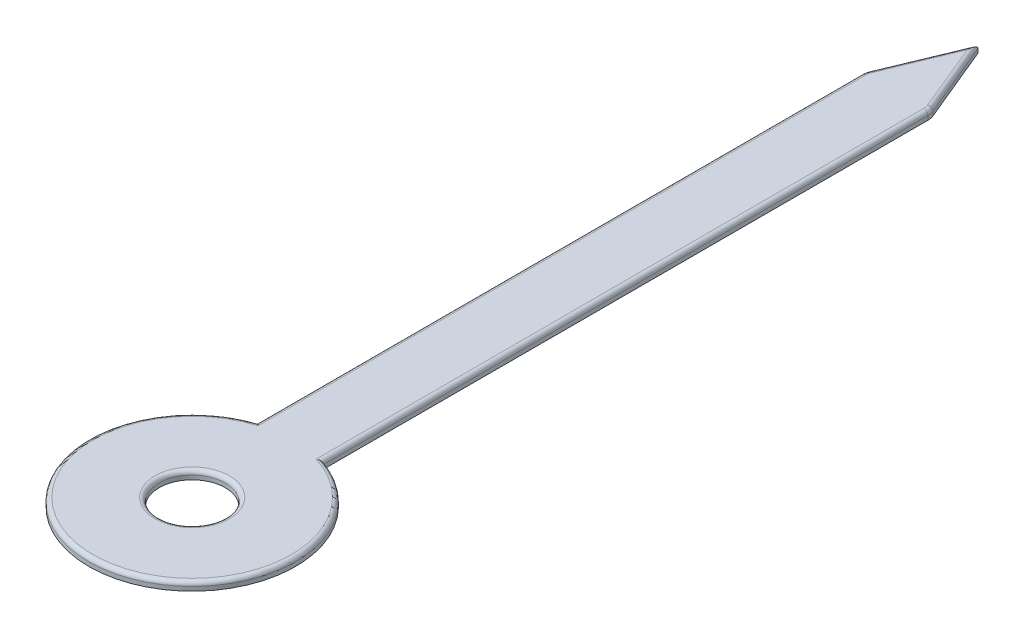
ISO-10303-21;
HEADER;
FILE_DESCRIPTION(('STEP AP214'),'2;1');
FILE_NAME('part.step','',(''),(''),'','','');
FILE_SCHEMA(('AUTOMOTIVE_DESIGN { 1 0 10303 214 1 1 1 1 }'));
ENDSEC;
DATA;
#1=APPLICATION_CONTEXT('core data for automotive mechanical design processes');
#2=APPLICATION_PROTOCOL_DEFINITION('international standard','automotive_design',2000,#1);
#3=PRODUCT_CONTEXT('',#1,'mechanical');
#4=PRODUCT('Part','Part','',(#3));
#5=PRODUCT_RELATED_PRODUCT_CATEGORY('part','',(#4));
#6=PRODUCT_DEFINITION_FORMATION('','',#4);
#7=PRODUCT_DEFINITION_CONTEXT('part definition',#1,'design');
#8=PRODUCT_DEFINITION('design','',#6,#7);
#9=PRODUCT_DEFINITION_SHAPE('','',#8);
#10=(LENGTH_UNIT() NAMED_UNIT(*) SI_UNIT(.MILLI.,.METRE.));
#11=(NAMED_UNIT(*) PLANE_ANGLE_UNIT() SI_UNIT($,.RADIAN.));
#12=(NAMED_UNIT(*) SI_UNIT($,.STERADIAN.) SOLID_ANGLE_UNIT());
#13=UNCERTAINTY_MEASURE_WITH_UNIT(LENGTH_MEASURE(1.E-05),#10,'distance_accuracy_value','');
#14=(GEOMETRIC_REPRESENTATION_CONTEXT(3) GLOBAL_UNCERTAINTY_ASSIGNED_CONTEXT((#13)) GLOBAL_UNIT_ASSIGNED_CONTEXT((#10,
#11,#12)) REPRESENTATION_CONTEXT('',''));
#15=CARTESIAN_POINT('',(0.,0.,0.));
#16=DIRECTION('',(0.,0.,1.));
#17=DIRECTION('',(1.,0.,0.));
#18=AXIS2_PLACEMENT_3D('',#15,#16,#17);
#19=CARTESIAN_POINT('',(0.,0.1,0.));
#20=DIRECTION('',(0.,1.,0.));
#21=DIRECTION('',(0.,0.,1.));
#22=AXIS2_PLACEMENT_3D('',#19,#20,#21);
#23=PLANE('',#22);
#24=CARTESIAN_POINT('',(0.,0.1,0.));
#25=DIRECTION('',(0.,1.,0.));
#26=DIRECTION('',(0.,0.,1.));
#27=AXIS2_PLACEMENT_3D('',#24,#25,#26);
#28=CIRCLE('',#27,0.45);
#29=CARTESIAN_POINT('',(0.,0.1,0.45));
#30=VERTEX_POINT('',#29);
#31=EDGE_CURVE('E188',#30,#30,#28,.F.);
#32=ORIENTED_EDGE('',*,*,#31,.T.);
#33=EDGE_LOOP('',(#32));
#34=FACE_BOUND('',#33,.T.);
#35=CARTESIAN_POINT('',(0.2,0.1,-8.49453210157484));
#36=DIRECTION('',(0.,1.,0.));
#37=DIRECTION('',(0.,0.,1.));
#38=AXIS2_PLACEMENT_3D('',#35,#36,#37);
#39=CIRCLE('',#38,0.15);
#40=CARTESIAN_POINT('',(0.35,0.1,-8.49453210157484));
#41=VERTEX_POINT('',#40);
#42=CARTESIAN_POINT('',(0.338581929876693,0.1,-8.5519346164296));
#43=VERTEX_POINT('',#42);
#44=EDGE_CURVE('E183',#41,#43,#39,.T.);
#45=ORIENTED_EDGE('',*,*,#44,.T.);
#46=DIRECTION('',(-0.382683432365091,0.,-0.923879532511286));
#47=VECTOR('',#46,1.);
#48=CARTESIAN_POINT('',(-0.0461939766255646,0.1,-9.48086582838175));
#49=LINE('',#48,#47);
#50=CARTESIAN_POINT('',(0.,0.1,-9.36934370351236));
#51=VERTEX_POINT('',#50);
#52=EDGE_CURVE('E185',#43,#51,#49,.T.);
#53=ORIENTED_EDGE('',*,*,#52,.T.);
#54=DIRECTION('',(-0.382683432365091,0.,0.923879532511286));
#55=VECTOR('',#54,1.);
#56=CARTESIAN_POINT('',(-0.338581929876694,0.1,-8.55193461642959));
#57=LINE('',#56,#55);
#58=CARTESIAN_POINT('',(-0.338581929876693,0.1,-8.55193461642959));
#59=VERTEX_POINT('',#58);
#60=EDGE_CURVE('E173',#51,#59,#57,.T.);
#61=ORIENTED_EDGE('',*,*,#60,.T.);
#62=CARTESIAN_POINT('',(-0.2,0.1,-8.49453210157483));
#63=DIRECTION('',(0.,1.,0.));
#64=DIRECTION('',(0.,0.,1.));
#65=AXIS2_PLACEMENT_3D('',#62,#63,#64);
#66=CIRCLE('',#65,0.15);
#67=CARTESIAN_POINT('',(-0.35,0.1,-8.49453210157483));
#68=VERTEX_POINT('',#67);
#69=EDGE_CURVE('E175',#59,#68,#66,.T.);
#70=ORIENTED_EDGE('',*,*,#69,.T.);
#71=DIRECTION('',(0.,0.,1.));
#72=VECTOR('',#71,1.);
#73=CARTESIAN_POINT('',(-0.35,0.1,-1.1842719282327));
#74=LINE('',#73,#72);
#75=CARTESIAN_POINT('',(-0.35,0.1,-1.1478240283249));
#76=VERTEX_POINT('',#75);
#77=EDGE_CURVE('E177',#68,#76,#74,.T.);
#78=ORIENTED_EDGE('',*,*,#77,.T.);
#79=CARTESIAN_POINT('',(0.,0.1,0.));
#80=DIRECTION('',(0.,1.,0.));
#81=DIRECTION('',(0.,0.,1.));
#82=AXIS2_PLACEMENT_3D('',#79,#80,#81);
#83=CIRCLE('',#82,1.2);
#84=CARTESIAN_POINT('',(0.35,0.1,-1.1478240283249));
#85=VERTEX_POINT('',#84);
#86=EDGE_CURVE('E179',#76,#85,#83,.T.);
#87=ORIENTED_EDGE('',*,*,#86,.T.);
#88=DIRECTION('',(0.,0.,-1.));
#89=VECTOR('',#88,1.);
#90=CARTESIAN_POINT('',(0.35,0.1,-8.49453210157484));
#91=LINE('',#90,#89);
#92=EDGE_CURVE('E181',#85,#41,#91,.T.);
#93=ORIENTED_EDGE('',*,*,#92,.T.);
#94=EDGE_LOOP('',(#45,#53,#61,#70,#78,#87,#93));
#95=FACE_BOUND('',#94,.T.);
#96=ADVANCED_FACE('F33',(#34,#95),#23,.T.);
#97=CARTESIAN_POINT('',(0.,0.,0.));
#98=DIRECTION('',(0.,1.,0.));
#99=DIRECTION('',(0.,0.,1.));
#100=AXIS2_PLACEMENT_3D('',#97,#98,#99);
#101=PLANE('',#100);
#102=DIRECTION('',(0.,0.,1.));
#103=VECTOR('',#102,1.);
#104=CARTESIAN_POINT('',(-0.4,0.,-1.1842719282327));
#105=LINE('',#104,#103);
#106=CARTESIAN_POINT('',(-0.4,0.,-8.49453210157483));
#107=VERTEX_POINT('',#106);
#108=CARTESIAN_POINT('',(-0.4,0.,-1.1842719282327));
#109=VERTEX_POINT('',#108);
#110=EDGE_CURVE('E145',#107,#109,#105,.T.);
#111=ORIENTED_EDGE('',*,*,#110,.F.);
#112=CARTESIAN_POINT('',(-0.2,0.,-8.49453210157483));
#113=DIRECTION('',(0.,1.,0.));
#114=DIRECTION('',(0.,0.,1.));
#115=AXIS2_PLACEMENT_3D('',#112,#113,#114);
#116=CIRCLE('',#115,0.2);
#117=CARTESIAN_POINT('',(-0.384775906502258,0.,-8.57106878804785));
#118=VERTEX_POINT('',#117);
#119=EDGE_CURVE('E144',#107,#118,#116,.F.);
#120=ORIENTED_EDGE('',*,*,#119,.T.);
#121=DIRECTION('',(-0.382683432365091,0.,0.923879532511286));
#122=VECTOR('',#121,1.);
#123=CARTESIAN_POINT('',(0.,0.,-9.5));
#124=LINE('',#123,#122);
#125=CARTESIAN_POINT('',(0.,0.,-9.5));
#126=VERTEX_POINT('',#125);
#127=EDGE_CURVE('E123',#126,#118,#124,.T.);
#128=ORIENTED_EDGE('',*,*,#127,.F.);
#129=DIRECTION('',(-0.382683432365091,0.,-0.923879532511286));
#130=VECTOR('',#129,1.);
#131=CARTESIAN_POINT('',(0.,0.,-9.5));
#132=LINE('',#131,#130);
#133=CARTESIAN_POINT('',(0.384775906502257,0.,-8.57106878804785));
#134=VERTEX_POINT('',#133);
#135=EDGE_CURVE('E132',#134,#126,#132,.T.);
#136=ORIENTED_EDGE('',*,*,#135,.F.);
#137=CARTESIAN_POINT('',(0.2,0.,-8.49453210157484));
#138=DIRECTION('',(0.,1.,0.));
#139=DIRECTION('',(0.,0.,1.));
#140=AXIS2_PLACEMENT_3D('',#137,#138,#139);
#141=CIRCLE('',#140,0.2);
#142=CARTESIAN_POINT('',(0.4,0.,-8.49453210157484));
#143=VERTEX_POINT('',#142);
#144=EDGE_CURVE('E161',#134,#143,#141,.F.);
#145=ORIENTED_EDGE('',*,*,#144,.T.);
#146=DIRECTION('',(0.,0.,-1.));
#147=VECTOR('',#146,1.);
#148=CARTESIAN_POINT('',(0.4,0.,-1.1842719282327));
#149=LINE('',#148,#147);
#150=CARTESIAN_POINT('',(0.4,0.,-1.1842719282327));
#151=VERTEX_POINT('',#150);
#152=EDGE_CURVE('E154',#151,#143,#149,.T.);
#153=ORIENTED_EDGE('',*,*,#152,.F.);
#154=CARTESIAN_POINT('',(0.,0.,0.));
#155=DIRECTION('',(0.,1.,0.));
#156=DIRECTION('',(0.,0.,1.));
#157=AXIS2_PLACEMENT_3D('',#154,#155,#156);
#158=CIRCLE('',#157,1.25);
#159=EDGE_CURVE('E148',#109,#151,#158,.T.);
#160=ORIENTED_EDGE('',*,*,#159,.F.);
#161=EDGE_LOOP('',(#111,#120,#128,#136,#145,#153,#160));
#162=FACE_BOUND('',#161,.T.);
#163=CARTESIAN_POINT('',(0.,0.,0.));
#164=DIRECTION('',(0.,1.,0.));
#165=DIRECTION('',(0.,0.,1.));
#166=AXIS2_PLACEMENT_3D('',#163,#164,#165);
#167=CIRCLE('',#166,0.4);
#168=CARTESIAN_POINT('',(0.,0.,0.4));
#169=VERTEX_POINT('',#168);
#170=EDGE_CURVE('E138',#169,#169,#167,.T.);
#171=ORIENTED_EDGE('',*,*,#170,.T.);
#172=EDGE_LOOP('',(#171));
#173=FACE_BOUND('',#172,.T.);
#174=ADVANCED_FACE('F141',(#162,#173),#101,.F.);
#175=CARTESIAN_POINT('',(0.,0.1,-9.5));
#176=DIRECTION('',(-0.923879532511286,0.,0.382683432365091));
#177=DIRECTION('',(0.382683432365091,0.,0.923879532511286));
#178=AXIS2_PLACEMENT_3D('',#175,#176,#177);
#179=PLANE('',#178);
#180=DIRECTION('',(0.,-1.,0.));
#181=VECTOR('',#180,1.);
#182=CARTESIAN_POINT('',(0.,0.1,-9.5));
#183=LINE('',#182,#181);
#184=CARTESIAN_POINT('',(0.,0.05,-9.5));
#185=VERTEX_POINT('',#184);
#186=EDGE_CURVE('E119',#185,#126,#183,.T.);
#187=ORIENTED_EDGE('',*,*,#186,.F.);
#188=DIRECTION('',(-0.382683432365091,0.,-0.923879532511286));
#189=VECTOR('',#188,1.);
#190=CARTESIAN_POINT('',(0.384775906502257,0.05,-8.57106878804785));
#191=LINE('',#190,#189);
#192=CARTESIAN_POINT('',(0.384775906502257,0.05,-8.57106878804785));
#193=VERTEX_POINT('',#192);
#194=EDGE_CURVE('E191',#185,#193,#191,.F.);
#195=ORIENTED_EDGE('',*,*,#194,.T.);
#196=DIRECTION('',(0.,-1.,0.));
#197=VECTOR('',#196,1.);
#198=CARTESIAN_POINT('',(0.384775906502257,0.1,-8.57106878804785));
#199=LINE('',#198,#197);
#200=EDGE_CURVE('E135',#193,#134,#199,.T.);
#201=ORIENTED_EDGE('',*,*,#200,.T.);
#202=ORIENTED_EDGE('',*,*,#135,.T.);
#203=EDGE_LOOP('',(#187,#195,#201,#202));
#204=FACE_BOUND('',#203,.T.);
#205=ADVANCED_FACE('F133',(#204),#179,.F.);
#206=CARTESIAN_POINT('',(0.,0.1,-9.5));
#207=DIRECTION('',(0.923879532511286,0.,0.382683432365091));
#208=DIRECTION('',(0.382683432365091,0.,-0.923879532511286));
#209=AXIS2_PLACEMENT_3D('',#206,#207,#208);
#210=PLANE('',#209);
#211=DIRECTION('',(0.,-1.,0.));
#212=VECTOR('',#211,1.);
#213=CARTESIAN_POINT('',(-0.384775906502258,0.1,-8.57106878804785));
#214=LINE('',#213,#212);
#215=CARTESIAN_POINT('',(-0.384775906502258,0.05,-8.57106878804785));
#216=VERTEX_POINT('',#215);
#217=EDGE_CURVE('E164',#118,#216,#214,.F.);
#218=ORIENTED_EDGE('',*,*,#217,.T.);
#219=DIRECTION('',(-0.382683432365091,0.,0.923879532511286));
#220=VECTOR('',#219,1.);
#221=CARTESIAN_POINT('',(0.,0.05,-9.5));
#222=LINE('',#221,#220);
#223=EDGE_CURVE('E11',#216,#185,#222,.F.);
#224=ORIENTED_EDGE('',*,*,#223,.T.);
#225=ORIENTED_EDGE('',*,*,#186,.T.);
#226=ORIENTED_EDGE('',*,*,#127,.T.);
#227=EDGE_LOOP('',(#218,#224,#225,#226));
#228=FACE_BOUND('',#227,.T.);
#229=ADVANCED_FACE('F121',(#228),#210,.F.);
#230=CARTESIAN_POINT('',(-0.4,0.1,-1.1842719282327));
#231=DIRECTION('',(1.,0.,0.));
#232=DIRECTION('',(0.,0.,-1.));
#233=AXIS2_PLACEMENT_3D('',#230,#231,#232);
#234=PLANE('',#233);
#235=DIRECTION('',(0.,-1.,0.));
#236=VECTOR('',#235,1.);
#237=CARTESIAN_POINT('',(-0.4,0.1,-1.1842719282327));
#238=LINE('',#237,#236);
#239=CARTESIAN_POINT('',(-0.4,0.05,-1.1842719282327));
#240=VERTEX_POINT('',#239);
#241=EDGE_CURVE('E129',#240,#109,#238,.T.);
#242=ORIENTED_EDGE('',*,*,#241,.F.);
#243=DIRECTION('',(0.,0.,1.));
#244=VECTOR('',#243,1.);
#245=CARTESIAN_POINT('',(-0.4,0.05,-8.49453210157483));
#246=LINE('',#245,#244);
#247=CARTESIAN_POINT('',(-0.4,0.05,-8.49453210157483));
#248=VERTEX_POINT('',#247);
#249=EDGE_CURVE('E61',#240,#248,#246,.F.);
#250=ORIENTED_EDGE('',*,*,#249,.T.);
#251=DIRECTION('',(0.,-1.,0.));
#252=VECTOR('',#251,1.);
#253=CARTESIAN_POINT('',(-0.4,0.1,-8.49453210157483));
#254=LINE('',#253,#252);
#255=EDGE_CURVE('E128',#248,#107,#254,.T.);
#256=ORIENTED_EDGE('',*,*,#255,.T.);
#257=ORIENTED_EDGE('',*,*,#110,.T.);
#258=EDGE_LOOP('',(#242,#250,#256,#257));
#259=FACE_BOUND('',#258,.T.);
#260=ADVANCED_FACE('F255',(#259),#234,.F.);
#261=CARTESIAN_POINT('',(0.,0.1,0.));
#262=DIRECTION('',(0.,-1.,0.));
#263=DIRECTION('',(0.,0.,-1.));
#264=AXIS2_PLACEMENT_3D('',#261,#262,#263);
#265=CYLINDRICAL_SURFACE('',#264,1.25);
#266=DIRECTION('',(0.,-1.,0.));
#267=VECTOR('',#266,1.);
#268=CARTESIAN_POINT('',(0.4,0.1,-1.1842719282327));
#269=LINE('',#268,#267);
#270=CARTESIAN_POINT('',(0.4,0.05,-1.1842719282327));
#271=VERTEX_POINT('',#270);
#272=EDGE_CURVE('E157',#271,#151,#269,.T.);
#273=ORIENTED_EDGE('',*,*,#272,.F.);
#274=CARTESIAN_POINT('',(0.,0.05,0.));
#275=DIRECTION('',(0.,1.,0.));
#276=DIRECTION('',(0.,0.,1.));
#277=AXIS2_PLACEMENT_3D('',#274,#275,#276);
#278=CIRCLE('',#277,1.25);
#279=EDGE_CURVE('E197',#271,#240,#278,.F.);
#280=ORIENTED_EDGE('',*,*,#279,.T.);
#281=ORIENTED_EDGE('',*,*,#241,.T.);
#282=ORIENTED_EDGE('',*,*,#159,.T.);
#283=EDGE_LOOP('',(#273,#280,#281,#282));
#284=FACE_BOUND('',#283,.T.);
#285=ADVANCED_FACE('F251',(#284),#265,.T.);
#286=CARTESIAN_POINT('',(0.4,0.1,-1.1842719282327));
#287=DIRECTION('',(-1.,0.,0.));
#288=DIRECTION('',(0.,0.,1.));
#289=AXIS2_PLACEMENT_3D('',#286,#287,#288);
#290=PLANE('',#289);
#291=DIRECTION('',(0.,-1.,0.));
#292=VECTOR('',#291,1.);
#293=CARTESIAN_POINT('',(0.4,0.1,-8.49453210157484));
#294=LINE('',#293,#292);
#295=CARTESIAN_POINT('',(0.4,0.05,-8.49453210157484));
#296=VERTEX_POINT('',#295);
#297=EDGE_CURVE('E167',#143,#296,#294,.F.);
#298=ORIENTED_EDGE('',*,*,#297,.T.);
#299=DIRECTION('',(0.,0.,-1.));
#300=VECTOR('',#299,1.);
#301=CARTESIAN_POINT('',(0.4,0.05,-1.1842719282327));
#302=LINE('',#301,#300);
#303=EDGE_CURVE('E195',#296,#271,#302,.F.);
#304=ORIENTED_EDGE('',*,*,#303,.T.);
#305=ORIENTED_EDGE('',*,*,#272,.T.);
#306=ORIENTED_EDGE('',*,*,#152,.T.);
#307=EDGE_LOOP('',(#298,#304,#305,#306));
#308=FACE_BOUND('',#307,.T.);
#309=ADVANCED_FACE('F248',(#308),#290,.F.);
#310=CARTESIAN_POINT('',(0.,0.1,0.));
#311=DIRECTION('',(0.,-1.,0.));
#312=DIRECTION('',(0.,0.,-1.));
#313=AXIS2_PLACEMENT_3D('',#310,#311,#312);
#314=CYLINDRICAL_SURFACE('',#313,0.4);
#315=CARTESIAN_POINT('',(0.,0.05,0.));
#316=DIRECTION('',(0.,1.,0.));
#317=DIRECTION('',(0.,0.,1.));
#318=AXIS2_PLACEMENT_3D('',#315,#316,#317);
#319=CIRCLE('',#318,0.4);
#320=CARTESIAN_POINT('',(0.,0.05,0.4));
#321=VERTEX_POINT('',#320);
#322=EDGE_CURVE('E170',#321,#321,#319,.T.);
#323=ORIENTED_EDGE('',*,*,#322,.T.);
#324=EDGE_LOOP('',(#323));
#325=FACE_BOUND('',#324,.T.);
#326=ORIENTED_EDGE('',*,*,#170,.F.);
#327=EDGE_LOOP('',(#326));
#328=FACE_BOUND('',#327,.T.);
#329=ADVANCED_FACE('F246',(#325,#328),#314,.F.);
#330=CARTESIAN_POINT('',(-0.2,0.1,-8.49453210157483));
#331=DIRECTION('',(0.,-1.,0.));
#332=DIRECTION('',(0.,0.,-1.));
#333=AXIS2_PLACEMENT_3D('',#330,#331,#332);
#334=CYLINDRICAL_SURFACE('',#333,0.2);
#335=ORIENTED_EDGE('',*,*,#255,.F.);
#336=CARTESIAN_POINT('',(-0.2,0.05,-8.49453210157483));
#337=DIRECTION('',(0.,1.,0.));
#338=DIRECTION('',(0.,0.,1.));
#339=AXIS2_PLACEMENT_3D('',#336,#337,#338);
#340=CIRCLE('',#339,0.2);
#341=EDGE_CURVE('E46',#248,#216,#340,.F.);
#342=ORIENTED_EDGE('',*,*,#341,.T.);
#343=ORIENTED_EDGE('',*,*,#217,.F.);
#344=ORIENTED_EDGE('',*,*,#119,.F.);
#345=EDGE_LOOP('',(#335,#342,#343,#344));
#346=FACE_BOUND('',#345,.T.);
#347=ADVANCED_FACE('F263',(#346),#334,.T.);
#348=CARTESIAN_POINT('',(0.2,0.1,-8.49453210157484));
#349=DIRECTION('',(0.,-1.,0.));
#350=DIRECTION('',(0.,0.,-1.));
#351=AXIS2_PLACEMENT_3D('',#348,#349,#350);
#352=CYLINDRICAL_SURFACE('',#351,0.2);
#353=ORIENTED_EDGE('',*,*,#200,.F.);
#354=CARTESIAN_POINT('',(0.2,0.05,-8.49453210157484));
#355=DIRECTION('',(0.,1.,0.));
#356=DIRECTION('',(0.,0.,1.));
#357=AXIS2_PLACEMENT_3D('',#354,#355,#356);
#358=CIRCLE('',#357,0.2);
#359=EDGE_CURVE('E193',#193,#296,#358,.F.);
#360=ORIENTED_EDGE('',*,*,#359,.T.);
#361=ORIENTED_EDGE('',*,*,#297,.F.);
#362=ORIENTED_EDGE('',*,*,#144,.F.);
#363=EDGE_LOOP('',(#353,#360,#361,#362));
#364=FACE_BOUND('',#363,.T.);
#365=ADVANCED_FACE('F233',(#364),#352,.T.);
#366=CARTESIAN_POINT('',(0.,0.05,0.));
#367=DIRECTION('',(0.,1.,0.));
#368=DIRECTION('',(0.,0.,1.));
#369=AXIS2_PLACEMENT_3D('',#366,#367,#368);
#370=TOROIDAL_SURFACE('',#369,0.45,0.05);
#371=ORIENTED_EDGE('',*,*,#31,.F.);
#372=EDGE_LOOP('',(#371));
#373=FACE_BOUND('',#372,.T.);
#374=ORIENTED_EDGE('',*,*,#322,.F.);
#375=EDGE_LOOP('',(#374));
#376=FACE_BOUND('',#375,.T.);
#377=ADVANCED_FACE('F225',(#373,#376),#370,.T.);
#378=CARTESIAN_POINT('',(0.,0.05,0.));
#379=DIRECTION('',(0.,1.,0.));
#380=DIRECTION('',(0.,0.,1.));
#381=AXIS2_PLACEMENT_3D('',#378,#379,#380);
#382=TOROIDAL_SURFACE('',#381,1.2,0.05);
#383=CARTESIAN_POINT('',(0.4,0.05,-1.1842719282327));
#384=CARTESIAN_POINT('',(0.400003538242326,0.052438214958611,-1.18427439239638));
#385=CARTESIAN_POINT('',(0.399821908510574,0.0548727410380665,-1.18414410556101));
#386=CARTESIAN_POINT('',(0.399117587237229,0.0596523224946209,-1.18363846163614));
#387=CARTESIAN_POINT('',(0.39859681167944,0.0619978026228749,-1.18326448127145));
#388=CARTESIAN_POINT('',(0.397243836660843,0.0665428709801627,-1.18229215607175));
#389=CARTESIAN_POINT('',(0.39641207242549,0.0687426580641196,-1.18169412479135));
#390=CARTESIAN_POINT('',(0.394479282172653,0.0729558031519046,-1.18030303984126));
#391=CARTESIAN_POINT('',(0.393377932574104,0.0749689330789746,-1.17950975180011));
#392=CARTESIAN_POINT('',(0.390871013916815,0.078902560925201,-1.17770182567032));
#393=CARTESIAN_POINT('',(0.389450112479835,0.080808059562213,-1.17667599631701));
#394=CARTESIAN_POINT('',(0.386406724969967,0.0843512852377126,-1.17447547633139));
#395=CARTESIAN_POINT('',(0.384784199959058,0.0859889604116242,-1.1733007569442));
#396=CARTESIAN_POINT('',(0.381080006656111,0.0892577603815212,-1.1706144183335));
#397=CARTESIAN_POINT('',(0.378968028710802,0.090835782544185,-1.16908005745182));
#398=CARTESIAN_POINT('',(0.37458884714767,0.0936133801366532,-1.16589175778281));
#399=CARTESIAN_POINT('',(0.372321435076969,0.0948124347533063,-1.16423765824069));
#400=CARTESIAN_POINT('',(0.366973480179624,0.0971468536538838,-1.16032745700828));
#401=CARTESIAN_POINT('',(0.363856543417841,0.0981502976797317,-1.15804210639865));
#402=CARTESIAN_POINT('',(0.357545952282898,0.0995325217929076,-1.15340083803831));
#403=CARTESIAN_POINT('',(0.354352431592616,0.0999123199321119,-1.15104504169987));
#404=CARTESIAN_POINT('',(0.350774733767325,0.0999954994664862,-1.14839763664954));
#405=CARTESIAN_POINT('',(0.350387303009783,0.0999999994813377,-1.14811083968445));
#406=CARTESIAN_POINT('',(0.35,0.1,-1.1478240283249));
#407=B_SPLINE_CURVE_WITH_KNOTS('',3,(#383,#384,#385,#386,#387,#388,#389,#390,#391,#392,#393,
#394,#395,#396,#397,#398,#399,#400,#401,#402,#403,#404,#405,#406),.UNSPECIFIED.,.F.,.F.,(4,2,2,
2,2,2,2,2,2,2,2,4),(0.,0.00729859881775275,0.0145563182119112,0.0218039182912878,
0.0290602606334385,0.0367978737149072,0.0445369834316091,0.0536542920492381,0.0627840765958546,
0.0747093644205014,0.0866151657461787,0.088061227780524),.UNSPECIFIED.);
#408=EDGE_CURVE('E213',#85,#271,#407,.F.);
#409=ORIENTED_EDGE('',*,*,#408,.F.);
#410=ORIENTED_EDGE('',*,*,#86,.F.);
#411=CARTESIAN_POINT('',(-0.4,0.05,-1.1842719282327));
#412=CARTESIAN_POINT('',(-0.400003538242326,0.052438214958611,-1.18427439239638));
#413=CARTESIAN_POINT('',(-0.399821908510574,0.0548727410380665,-1.18414410556101));
#414=CARTESIAN_POINT('',(-0.399117587237229,0.0596523224946209,-1.18363846163614));
#415=CARTESIAN_POINT('',(-0.39859681167944,0.0619978026228748,-1.18326448127145));
#416=CARTESIAN_POINT('',(-0.397243836660843,0.0665428709801627,-1.18229215607175));
#417=CARTESIAN_POINT('',(-0.39641207242549,0.0687426580641196,-1.18169412479135));
#418=CARTESIAN_POINT('',(-0.394479282172653,0.0729558031519046,-1.18030303984126));
#419=CARTESIAN_POINT('',(-0.393377932574104,0.0749689330789746,-1.17950975180011));
#420=CARTESIAN_POINT('',(-0.390871013916815,0.078902560925201,-1.17770182567032));
#421=CARTESIAN_POINT('',(-0.389450112479835,0.0808080595622131,-1.17667599631701));
#422=CARTESIAN_POINT('',(-0.386406724969967,0.0843512852377126,-1.17447547633139));
#423=CARTESIAN_POINT('',(-0.384784199959058,0.0859889604116243,-1.1733007569442));
#424=CARTESIAN_POINT('',(-0.381080006656111,0.0892577603815212,-1.1706144183335));
#425=CARTESIAN_POINT('',(-0.378968028710802,0.090835782544185,-1.16908005745182));
#426=CARTESIAN_POINT('',(-0.37458884714767,0.0936133801366532,-1.16589175778281));
#427=CARTESIAN_POINT('',(-0.37232143507697,0.0948124347533063,-1.16423765824069));
#428=CARTESIAN_POINT('',(-0.366973480179624,0.0971468536538838,-1.16032745700828));
#429=CARTESIAN_POINT('',(-0.363856543417841,0.0981502976797317,-1.15804210639865));
#430=CARTESIAN_POINT('',(-0.357545952282898,0.0995325217929076,-1.15340083803831));
#431=CARTESIAN_POINT('',(-0.354352431592616,0.0999123199321119,-1.15104504169987));
#432=CARTESIAN_POINT('',(-0.350774733767325,0.0999954994664862,-1.14839763664954));
#433=CARTESIAN_POINT('',(-0.350387303009783,0.0999999994813377,-1.14811083968445));
#434=CARTESIAN_POINT('',(-0.35,0.1,-1.1478240283249));
#435=B_SPLINE_CURVE_WITH_KNOTS('',3,(#411,#412,#413,#414,#415,#416,#417,#418,#419,#420,#421,
#422,#423,#424,#425,#426,#427,#428,#429,#430,#431,#432,#433,#434),.UNSPECIFIED.,.F.,.F.,(4,2,2,
2,2,2,2,2,2,2,2,4),(0.,0.00729859881775274,0.0145563182119112,0.0218039182912878,
0.0290602606334385,0.0367978737149072,0.0445369834316092,0.0536542920492381,0.0627840765958547,
0.0747093644205013,0.0866151657461788,0.088061227780524),.UNSPECIFIED.);
#436=EDGE_CURVE('E38',#240,#76,#435,.T.);
#437=ORIENTED_EDGE('',*,*,#436,.F.);
#438=ORIENTED_EDGE('',*,*,#279,.F.);
#439=EDGE_LOOP('',(#409,#410,#437,#438));
#440=FACE_BOUND('',#439,.T.);
#441=ADVANCED_FACE('F222',(#440),#382,.T.);
#442=CARTESIAN_POINT('',(-0.35,0.05,0.));
#443=DIRECTION('',(0.,0.,-1.));
#444=DIRECTION('',(-1.,0.,0.));
#445=AXIS2_PLACEMENT_3D('',#442,#443,#444);
#446=CYLINDRICAL_SURFACE('',#445,0.05);
#447=ORIENTED_EDGE('',*,*,#436,.T.);
#448=ORIENTED_EDGE('',*,*,#77,.F.);
#449=CARTESIAN_POINT('',(-0.35,0.05,-8.49453210157483));
#450=DIRECTION('',(0.,0.,-1.));
#451=DIRECTION('',(-1.,0.,0.));
#452=AXIS2_PLACEMENT_3D('',#449,#450,#451);
#453=CIRCLE('',#452,0.05);
#454=EDGE_CURVE('E211',#248,#68,#453,.T.);
#455=ORIENTED_EDGE('',*,*,#454,.F.);
#456=ORIENTED_EDGE('',*,*,#249,.F.);
#457=EDGE_LOOP('',(#447,#448,#455,#456));
#458=FACE_BOUND('',#457,.T.);
#459=ADVANCED_FACE('F35',(#458),#446,.T.);
#460=CARTESIAN_POINT('',(0.35,0.05,0.));
#461=DIRECTION('',(0.,0.,1.));
#462=DIRECTION('',(1.,0.,0.));
#463=AXIS2_PLACEMENT_3D('',#460,#461,#462);
#464=CYLINDRICAL_SURFACE('',#463,0.05);
#465=ORIENTED_EDGE('',*,*,#408,.T.);
#466=ORIENTED_EDGE('',*,*,#303,.F.);
#467=CARTESIAN_POINT('',(0.35,0.05,-8.49453210157484));
#468=DIRECTION('',(0.,0.,-1.));
#469=DIRECTION('',(-1.,0.,0.));
#470=AXIS2_PLACEMENT_3D('',#467,#468,#469);
#471=CIRCLE('',#470,0.05);
#472=EDGE_CURVE('E208',#41,#296,#471,.T.);
#473=ORIENTED_EDGE('',*,*,#472,.F.);
#474=ORIENTED_EDGE('',*,*,#92,.F.);
#475=EDGE_LOOP('',(#465,#466,#473,#474));
#476=FACE_BOUND('',#475,.T.);
#477=ADVANCED_FACE('F219',(#476),#464,.T.);
#478=CARTESIAN_POINT('',(-0.2,0.05,-8.49453210157483));
#479=DIRECTION('',(0.,1.,0.));
#480=DIRECTION('',(0.,0.,1.));
#481=AXIS2_PLACEMENT_3D('',#478,#479,#480);
#482=TOROIDAL_SURFACE('',#481,0.15,0.05);
#483=ORIENTED_EDGE('',*,*,#454,.T.);
#484=ORIENTED_EDGE('',*,*,#69,.F.);
#485=CARTESIAN_POINT('',(-0.338581929876693,0.05,-8.55193461642959));
#486=DIRECTION('',(0.382683432365096,0.,-0.923879532511284));
#487=DIRECTION('',(-0.923879532511284,0.,-0.382683432365096));
#488=AXIS2_PLACEMENT_3D('',#485,#486,#487);
#489=CIRCLE('',#488,0.05);
#490=EDGE_CURVE('E205',#216,#59,#489,.T.);
#491=ORIENTED_EDGE('',*,*,#490,.F.);
#492=ORIENTED_EDGE('',*,*,#341,.F.);
#493=EDGE_LOOP('',(#483,#484,#491,#492));
#494=FACE_BOUND('',#493,.T.);
#495=ADVANCED_FACE('F279',(#494),#482,.T.);
#496=CARTESIAN_POINT('',(0.2,0.05,-8.49453210157484));
#497=DIRECTION('',(0.,1.,0.));
#498=DIRECTION('',(0.,0.,1.));
#499=AXIS2_PLACEMENT_3D('',#496,#497,#498);
#500=TOROIDAL_SURFACE('',#499,0.15,0.05);
#501=ORIENTED_EDGE('',*,*,#472,.T.);
#502=ORIENTED_EDGE('',*,*,#359,.F.);
#503=CARTESIAN_POINT('',(0.338581929876693,0.05,-8.5519346164296));
#504=DIRECTION('',(-0.382683432365097,0.,-0.923879532511284));
#505=DIRECTION('',(-0.923879532511284,0.,0.382683432365097));
#506=AXIS2_PLACEMENT_3D('',#503,#504,#505);
#507=CIRCLE('',#506,0.05);
#508=EDGE_CURVE('E203',#43,#193,#507,.T.);
#509=ORIENTED_EDGE('',*,*,#508,.F.);
#510=ORIENTED_EDGE('',*,*,#44,.F.);
#511=EDGE_LOOP('',(#501,#502,#509,#510));
#512=FACE_BOUND('',#511,.T.);
#513=ADVANCED_FACE('F276',(#512),#500,.T.);
#514=CARTESIAN_POINT('',(-3.31256323401054,0.05,-1.37210861774565));
#515=DIRECTION('',(0.382683432365091,0.,-0.923879532511286));
#516=DIRECTION('',(-0.923879532511286,0.,-0.382683432365091));
#517=AXIS2_PLACEMENT_3D('',#514,#515,#516);
#518=CYLINDRICAL_SURFACE('',#517,0.05);
#519=ORIENTED_EDGE('',*,*,#490,.T.);
#520=ORIENTED_EDGE('',*,*,#60,.F.);
#521=CARTESIAN_POINT('',(0.,0.05,-9.36934370351237));
#522=DIRECTION('',(1.,0.,0.));
#523=DIRECTION('',(0.,0.,-1.));
#524=AXIS2_PLACEMENT_3D('',#521,#522,#523);
#525=ELLIPSE('',#524,0.130656296487637,0.05);
#526=EDGE_CURVE('E201',#185,#51,#525,.T.);
#527=ORIENTED_EDGE('',*,*,#526,.F.);
#528=ORIENTED_EDGE('',*,*,#223,.F.);
#529=EDGE_LOOP('',(#519,#520,#527,#528));
#530=FACE_BOUND('',#529,.T.);
#531=ADVANCED_FACE('F272',(#530),#518,.T.);
#532=CARTESIAN_POINT('',(3.31256323401054,0.05,-1.37210861774565));
#533=DIRECTION('',(0.382683432365091,0.,0.923879532511286));
#534=DIRECTION('',(0.923879532511286,0.,-0.382683432365091));
#535=AXIS2_PLACEMENT_3D('',#532,#533,#534);
#536=CYLINDRICAL_SURFACE('',#535,0.05);
#537=ORIENTED_EDGE('',*,*,#508,.T.);
#538=ORIENTED_EDGE('',*,*,#194,.F.);
#539=ORIENTED_EDGE('',*,*,#526,.T.);
#540=ORIENTED_EDGE('',*,*,#52,.F.);
#541=EDGE_LOOP('',(#537,#538,#539,#540));
#542=FACE_BOUND('',#541,.T.);
#543=ADVANCED_FACE('F269',(#542),#536,.T.);
#544=CLOSED_SHELL('',(#96,#174,#205,#229,#260,#285,#309,#329,#347,#365,#377,#441,#459,#477,#495,
#513,#531,#543));
#545=MANIFOLD_SOLID_BREP('B2',#544);
#546=ADVANCED_BREP_SHAPE_REPRESENTATION('',(#18,#545),#14);
#547=SHAPE_DEFINITION_REPRESENTATION(#9,#546);
ENDSEC;
END-ISO-10303-21;
